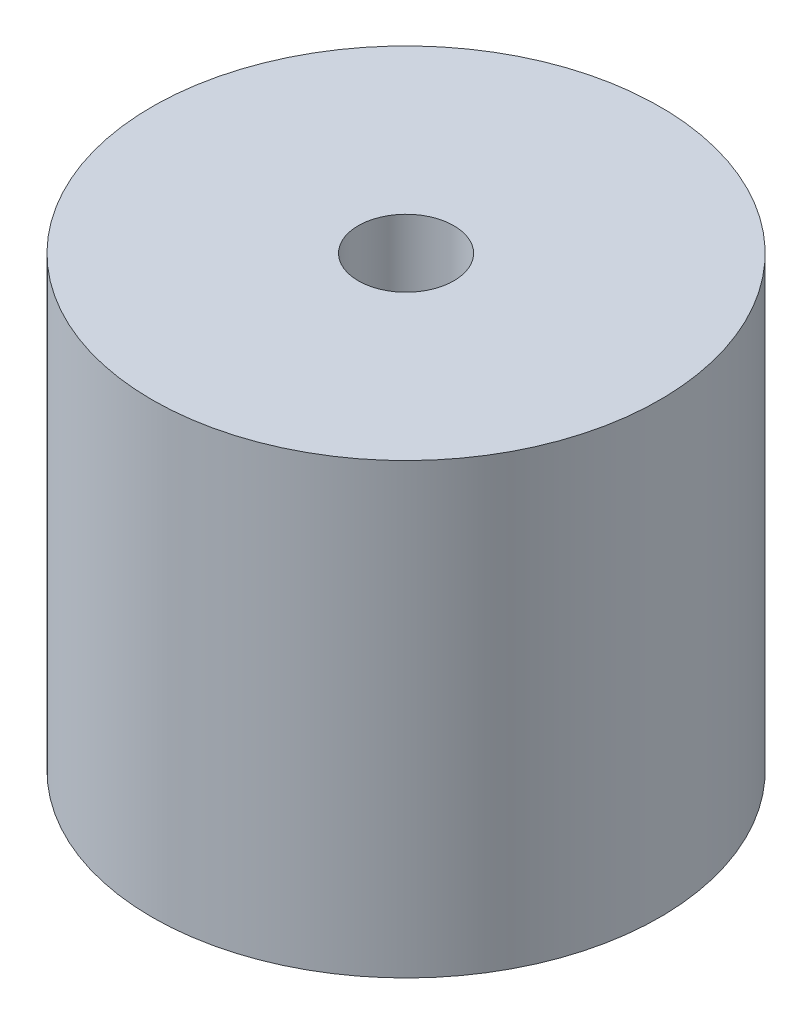
ISO-10303-21;
HEADER;
FILE_DESCRIPTION(('STEP AP214'),'2;1');
FILE_NAME('part.step','',(''),(''),'','','');
FILE_SCHEMA(('AUTOMOTIVE_DESIGN { 1 0 10303 214 1 1 1 1 }'));
ENDSEC;
DATA;
#1=APPLICATION_CONTEXT('core data for automotive mechanical design processes');
#2=APPLICATION_PROTOCOL_DEFINITION('international standard','automotive_design',2000,#1);
#3=PRODUCT_CONTEXT('',#1,'mechanical');
#4=PRODUCT('Part','Part','',(#3));
#5=PRODUCT_RELATED_PRODUCT_CATEGORY('part','',(#4));
#6=PRODUCT_DEFINITION_FORMATION('','',#4);
#7=PRODUCT_DEFINITION_CONTEXT('part definition',#1,'design');
#8=PRODUCT_DEFINITION('design','',#6,#7);
#9=PRODUCT_DEFINITION_SHAPE('','',#8);
#10=(LENGTH_UNIT() NAMED_UNIT(*) SI_UNIT(.MILLI.,.METRE.));
#11=(NAMED_UNIT(*) PLANE_ANGLE_UNIT() SI_UNIT($,.RADIAN.));
#12=(NAMED_UNIT(*) SI_UNIT($,.STERADIAN.) SOLID_ANGLE_UNIT());
#13=UNCERTAINTY_MEASURE_WITH_UNIT(LENGTH_MEASURE(1.E-05),#10,'distance_accuracy_value','');
#14=(GEOMETRIC_REPRESENTATION_CONTEXT(3) GLOBAL_UNCERTAINTY_ASSIGNED_CONTEXT((#13)) GLOBAL_UNIT_ASSIGNED_CONTEXT((#10,
#11,#12)) REPRESENTATION_CONTEXT('',''));
#15=CARTESIAN_POINT('',(0.,0.,0.));
#16=DIRECTION('',(0.,0.,1.));
#17=DIRECTION('',(1.,0.,0.));
#18=AXIS2_PLACEMENT_3D('',#15,#16,#17);
#19=CARTESIAN_POINT('',(0.,65.,0.));
#20=DIRECTION('',(0.,-1.,0.));
#21=DIRECTION('',(0.,0.,-1.));
#22=AXIS2_PLACEMENT_3D('',#19,#20,#21);
#23=CYLINDRICAL_SURFACE('',#22,6.);
#24=CARTESIAN_POINT('',(0.,50.,0.));
#25=DIRECTION('',(0.,1.,0.));
#26=DIRECTION('',(0.,0.,1.));
#27=AXIS2_PLACEMENT_3D('',#24,#25,#26);
#28=CIRCLE('',#27,6.);
#29=CARTESIAN_POINT('',(0.,50.,6.));
#30=VERTEX_POINT('',#29);
#31=EDGE_CURVE('E43',#30,#30,#28,.T.);
#32=ORIENTED_EDGE('',*,*,#31,.F.);
#33=EDGE_LOOP('',(#32));
#34=FACE_BOUND('',#33,.T.);
#35=CARTESIAN_POINT('',(0.,62.,0.));
#36=DIRECTION('',(0.,1.,0.));
#37=DIRECTION('',(0.,0.,1.));
#38=AXIS2_PLACEMENT_3D('',#35,#36,#37);
#39=CIRCLE('',#38,6.);
#40=CARTESIAN_POINT('',(0.,62.,6.));
#41=VERTEX_POINT('',#40);
#42=EDGE_CURVE('E45',#41,#41,#39,.T.);
#43=ORIENTED_EDGE('',*,*,#42,.T.);
#44=EDGE_LOOP('',(#43));
#45=FACE_BOUND('',#44,.T.);
#46=ADVANCED_FACE('F32',(#34,#45),#23,.F.);
#47=CARTESIAN_POINT('',(0.,65.,0.));
#48=DIRECTION('',(0.,-1.,0.));
#49=DIRECTION('',(0.,0.,-1.));
#50=AXIS2_PLACEMENT_3D('',#47,#48,#49);
#51=CYLINDRICAL_SURFACE('',#50,8.5);
#52=CARTESIAN_POINT('',(0.,65.,0.));
#53=DIRECTION('',(0.,1.,0.));
#54=DIRECTION('',(0.,0.,1.));
#55=AXIS2_PLACEMENT_3D('',#52,#53,#54);
#56=CIRCLE('',#55,8.5);
#57=CARTESIAN_POINT('',(0.,65.,8.5));
#58=VERTEX_POINT('',#57);
#59=EDGE_CURVE('E10',#58,#58,#56,.T.);
#60=ORIENTED_EDGE('',*,*,#59,.F.);
#61=EDGE_LOOP('',(#60));
#62=FACE_BOUND('',#61,.T.);
#63=CARTESIAN_POINT('',(0.,50.,0.));
#64=DIRECTION('',(0.,1.,0.));
#65=DIRECTION('',(0.,0.,1.));
#66=AXIS2_PLACEMENT_3D('',#63,#64,#65);
#67=CIRCLE('',#66,8.5);
#68=CARTESIAN_POINT('',(0.,50.,8.5));
#69=VERTEX_POINT('',#68);
#70=EDGE_CURVE('E35',#69,#69,#67,.T.);
#71=ORIENTED_EDGE('',*,*,#70,.T.);
#72=EDGE_LOOP('',(#71));
#73=FACE_BOUND('',#72,.T.);
#74=ADVANCED_FACE('F67',(#62,#73),#51,.T.);
#75=CARTESIAN_POINT('',(0.,65.,0.));
#76=DIRECTION('',(0.,1.,0.));
#77=DIRECTION('',(0.,0.,1.));
#78=AXIS2_PLACEMENT_3D('',#75,#76,#77);
#79=PLANE('',#78);
#80=ORIENTED_EDGE('',*,*,#59,.T.);
#81=EDGE_LOOP('',(#80));
#82=FACE_BOUND('',#81,.T.);
#83=CARTESIAN_POINT('',(0.,65.,0.));
#84=DIRECTION('',(0.,1.,0.));
#85=DIRECTION('',(0.,0.,1.));
#86=AXIS2_PLACEMENT_3D('',#83,#84,#85);
#87=CIRCLE('',#86,1.6);
#88=CARTESIAN_POINT('',(0.,65.,1.6));
#89=VERTEX_POINT('',#88);
#90=EDGE_CURVE('E55',#89,#89,#87,.T.);
#91=ORIENTED_EDGE('',*,*,#90,.F.);
#92=EDGE_LOOP('',(#91));
#93=FACE_BOUND('',#92,.T.);
#94=ADVANCED_FACE('F64',(#82,#93),#79,.T.);
#95=CARTESIAN_POINT('',(0.,50.,0.));
#96=DIRECTION('',(0.,1.,0.));
#97=DIRECTION('',(0.,0.,1.));
#98=AXIS2_PLACEMENT_3D('',#95,#96,#97);
#99=PLANE('',#98);
#100=ORIENTED_EDGE('',*,*,#31,.T.);
#101=EDGE_LOOP('',(#100));
#102=FACE_BOUND('',#101,.T.);
#103=ORIENTED_EDGE('',*,*,#70,.F.);
#104=EDGE_LOOP('',(#103));
#105=FACE_BOUND('',#104,.T.);
#106=ADVANCED_FACE('F66',(#102,#105),#99,.F.);
#107=CARTESIAN_POINT('',(0.,62.,0.));
#108=DIRECTION('',(0.,1.,0.));
#109=DIRECTION('',(0.,0.,1.));
#110=AXIS2_PLACEMENT_3D('',#107,#108,#109);
#111=PLANE('',#110);
#112=CARTESIAN_POINT('',(0.,62.,0.));
#113=DIRECTION('',(0.,1.,0.));
#114=DIRECTION('',(0.,0.,1.));
#115=AXIS2_PLACEMENT_3D('',#112,#113,#114);
#116=CIRCLE('',#115,1.6);
#117=CARTESIAN_POINT('',(0.,62.,1.6));
#118=VERTEX_POINT('',#117);
#119=EDGE_CURVE('E51',#118,#118,#116,.T.);
#120=ORIENTED_EDGE('',*,*,#119,.T.);
#121=EDGE_LOOP('',(#120));
#122=FACE_BOUND('',#121,.T.);
#123=ORIENTED_EDGE('',*,*,#42,.F.);
#124=EDGE_LOOP('',(#123));
#125=FACE_BOUND('',#124,.T.);
#126=ADVANCED_FACE('F73',(#122,#125),#111,.F.);
#127=CARTESIAN_POINT('',(0.,62.,0.));
#128=DIRECTION('',(0.,1.,0.));
#129=DIRECTION('',(0.,0.,1.));
#130=AXIS2_PLACEMENT_3D('',#127,#128,#129);
#131=CYLINDRICAL_SURFACE('',#130,1.6);
#132=ORIENTED_EDGE('',*,*,#119,.F.);
#133=EDGE_LOOP('',(#132));
#134=FACE_BOUND('',#133,.T.);
#135=ORIENTED_EDGE('',*,*,#90,.T.);
#136=EDGE_LOOP('',(#135));
#137=FACE_BOUND('',#136,.T.);
#138=ADVANCED_FACE('F62',(#134,#137),#131,.F.);
#139=CLOSED_SHELL('',(#46,#74,#94,#106,#126,#138));
#140=MANIFOLD_SOLID_BREP('B2',#139);
#141=ADVANCED_BREP_SHAPE_REPRESENTATION('',(#18,#140),#14);
#142=SHAPE_DEFINITION_REPRESENTATION(#9,#141);
ENDSEC;
END-ISO-10303-21;
